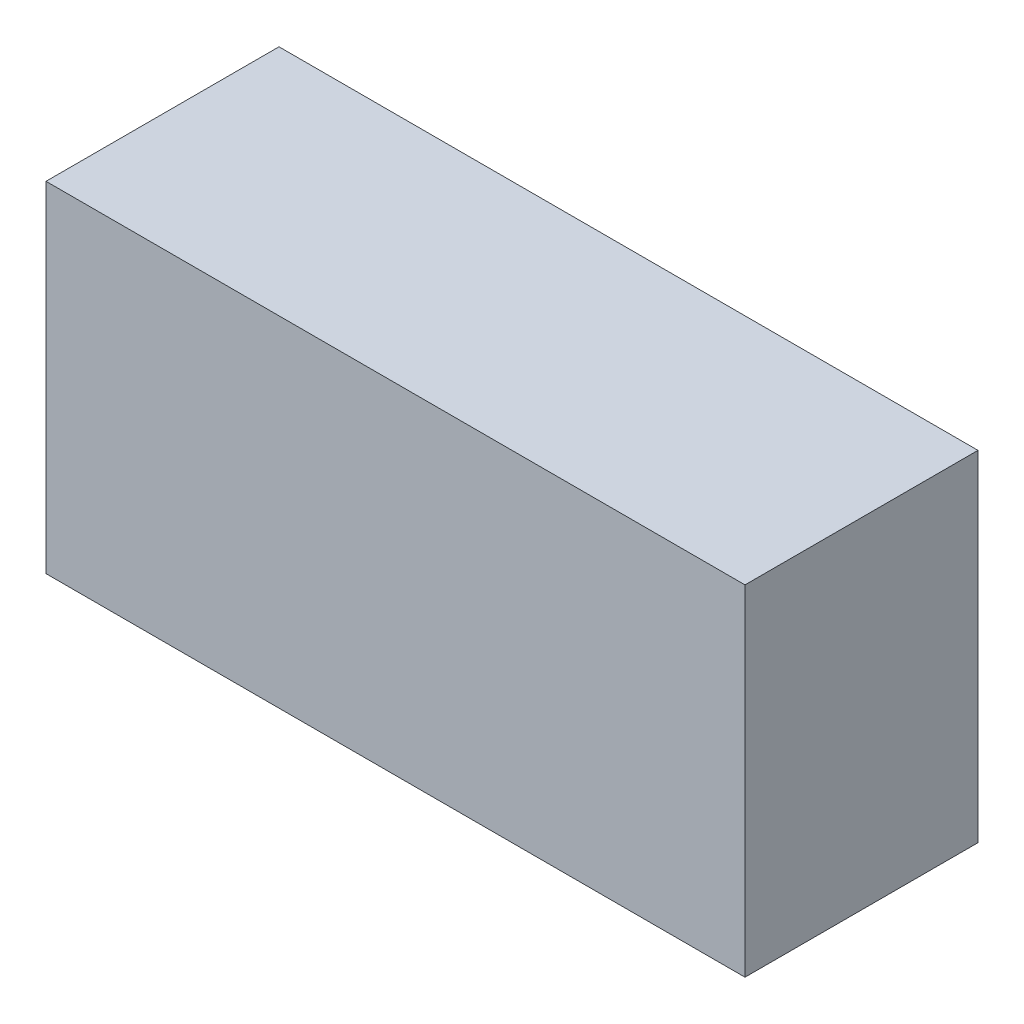
ISO-10303-21;
HEADER;
FILE_DESCRIPTION(('STEP AP214'),'2;1');
FILE_NAME('part.step','',(''),(''),'','','');
FILE_SCHEMA(('AUTOMOTIVE_DESIGN { 1 0 10303 214 1 1 1 1 }'));
ENDSEC;
DATA;
#1=APPLICATION_CONTEXT('core data for automotive mechanical design processes');
#2=APPLICATION_PROTOCOL_DEFINITION('international standard','automotive_design',2000,#1);
#3=PRODUCT_CONTEXT('',#1,'mechanical');
#4=PRODUCT('Part','Part','',(#3));
#5=PRODUCT_RELATED_PRODUCT_CATEGORY('part','',(#4));
#6=PRODUCT_DEFINITION_FORMATION('','',#4);
#7=PRODUCT_DEFINITION_CONTEXT('part definition',#1,'design');
#8=PRODUCT_DEFINITION('design','',#6,#7);
#9=PRODUCT_DEFINITION_SHAPE('','',#8);
#10=(LENGTH_UNIT() NAMED_UNIT(*) SI_UNIT(.MILLI.,.METRE.));
#11=(NAMED_UNIT(*) PLANE_ANGLE_UNIT() SI_UNIT($,.RADIAN.));
#12=(NAMED_UNIT(*) SI_UNIT($,.STERADIAN.) SOLID_ANGLE_UNIT());
#13=UNCERTAINTY_MEASURE_WITH_UNIT(LENGTH_MEASURE(1.E-05),#10,'distance_accuracy_value','');
#14=(GEOMETRIC_REPRESENTATION_CONTEXT(3) GLOBAL_UNCERTAINTY_ASSIGNED_CONTEXT((#13)) GLOBAL_UNIT_ASSIGNED_CONTEXT((#10,
#11,#12)) REPRESENTATION_CONTEXT('',''));
#15=CARTESIAN_POINT('',(0.,0.,0.));
#16=DIRECTION('',(0.,0.,1.));
#17=DIRECTION('',(1.,0.,0.));
#18=AXIS2_PLACEMENT_3D('',#15,#16,#17);
#19=CARTESIAN_POINT('',(0.,52.5,0.));
#20=DIRECTION('',(1.,0.,0.));
#21=DIRECTION('',(0.,0.,-1.));
#22=AXIS2_PLACEMENT_3D('',#19,#20,#21);
#23=PLANE('',#22);
#24=DIRECTION('',(0.,0.,1.));
#25=VECTOR('',#24,1.);
#26=CARTESIAN_POINT('',(0.,0.,0.));
#27=LINE('',#26,#25);
#28=CARTESIAN_POINT('',(0.,0.,-36.));
#29=VERTEX_POINT('',#28);
#30=CARTESIAN_POINT('',(0.,0.,0.));
#31=VERTEX_POINT('',#30);
#32=EDGE_CURVE('E112',#29,#31,#27,.T.);
#33=ORIENTED_EDGE('',*,*,#32,.T.);
#34=DIRECTION('',(0.,-1.,0.));
#35=VECTOR('',#34,1.);
#36=CARTESIAN_POINT('',(0.,52.5,0.));
#37=LINE('',#36,#35);
#38=CARTESIAN_POINT('',(0.,52.5,0.));
#39=VERTEX_POINT('',#38);
#40=EDGE_CURVE('E11',#39,#31,#37,.T.);
#41=ORIENTED_EDGE('',*,*,#40,.F.);
#42=DIRECTION('',(0.,0.,1.));
#43=VECTOR('',#42,1.);
#44=CARTESIAN_POINT('',(0.,52.5,0.));
#45=LINE('',#44,#43);
#46=CARTESIAN_POINT('',(0.,52.5,-36.));
#47=VERTEX_POINT('',#46);
#48=EDGE_CURVE('E95',#47,#39,#45,.T.);
#49=ORIENTED_EDGE('',*,*,#48,.F.);
#50=DIRECTION('',(0.,-1.,0.));
#51=VECTOR('',#50,1.);
#52=CARTESIAN_POINT('',(0.,52.5,-36.));
#53=LINE('',#52,#51);
#54=EDGE_CURVE('E108',#47,#29,#53,.T.);
#55=ORIENTED_EDGE('',*,*,#54,.T.);
#56=EDGE_LOOP('',(#33,#41,#49,#55));
#57=FACE_BOUND('',#56,.T.);
#58=ADVANCED_FACE('F43',(#57),#23,.F.);
#59=CARTESIAN_POINT('',(0.,52.5,0.));
#60=DIRECTION('',(0.,0.,-1.));
#61=DIRECTION('',(-1.,0.,0.));
#62=AXIS2_PLACEMENT_3D('',#59,#60,#61);
#63=PLANE('',#62);
#64=DIRECTION('',(1.,0.,0.));
#65=VECTOR('',#64,1.);
#66=CARTESIAN_POINT('',(0.,0.,0.));
#67=LINE('',#66,#65);
#68=CARTESIAN_POINT('',(108.,0.,0.));
#69=VERTEX_POINT('',#68);
#70=EDGE_CURVE('E100',#31,#69,#67,.T.);
#71=ORIENTED_EDGE('',*,*,#70,.T.);
#72=DIRECTION('',(0.,-1.,0.));
#73=VECTOR('',#72,1.);
#74=CARTESIAN_POINT('',(108.,52.5,0.));
#75=LINE('',#74,#73);
#76=CARTESIAN_POINT('',(108.,52.5,0.));
#77=VERTEX_POINT('',#76);
#78=EDGE_CURVE('E52',#77,#69,#75,.T.);
#79=ORIENTED_EDGE('',*,*,#78,.F.);
#80=DIRECTION('',(1.,0.,0.));
#81=VECTOR('',#80,1.);
#82=CARTESIAN_POINT('',(0.,52.5,0.));
#83=LINE('',#82,#81);
#84=EDGE_CURVE('E90',#39,#77,#83,.T.);
#85=ORIENTED_EDGE('',*,*,#84,.F.);
#86=ORIENTED_EDGE('',*,*,#40,.T.);
#87=EDGE_LOOP('',(#71,#79,#85,#86));
#88=FACE_BOUND('',#87,.T.);
#89=ADVANCED_FACE('F99',(#88),#63,.F.);
#90=CARTESIAN_POINT('',(108.,52.5,0.));
#91=DIRECTION('',(-1.,0.,0.));
#92=DIRECTION('',(0.,0.,1.));
#93=AXIS2_PLACEMENT_3D('',#90,#91,#92);
#94=PLANE('',#93);
#95=DIRECTION('',(0.,0.,-1.));
#96=VECTOR('',#95,1.);
#97=CARTESIAN_POINT('',(108.,0.,0.));
#98=LINE('',#97,#96);
#99=CARTESIAN_POINT('',(108.,0.,-36.));
#100=VERTEX_POINT('',#99);
#101=EDGE_CURVE('E77',#69,#100,#98,.T.);
#102=ORIENTED_EDGE('',*,*,#101,.T.);
#103=DIRECTION('',(0.,-1.,0.));
#104=VECTOR('',#103,1.);
#105=CARTESIAN_POINT('',(108.,52.5,-36.));
#106=LINE('',#105,#104);
#107=CARTESIAN_POINT('',(108.,52.5,-36.));
#108=VERTEX_POINT('',#107);
#109=EDGE_CURVE('E102',#108,#100,#106,.T.);
#110=ORIENTED_EDGE('',*,*,#109,.F.);
#111=DIRECTION('',(0.,0.,-1.));
#112=VECTOR('',#111,1.);
#113=CARTESIAN_POINT('',(108.,52.5,0.));
#114=LINE('',#113,#112);
#115=EDGE_CURVE('E93',#77,#108,#114,.T.);
#116=ORIENTED_EDGE('',*,*,#115,.F.);
#117=ORIENTED_EDGE('',*,*,#78,.T.);
#118=EDGE_LOOP('',(#102,#110,#116,#117));
#119=FACE_BOUND('',#118,.T.);
#120=ADVANCED_FACE('F103',(#119),#94,.F.);
#121=CARTESIAN_POINT('',(0.,52.5,-36.));
#122=DIRECTION('',(0.,0.,1.));
#123=DIRECTION('',(1.,0.,0.));
#124=AXIS2_PLACEMENT_3D('',#121,#122,#123);
#125=PLANE('',#124);
#126=DIRECTION('',(-1.,0.,0.));
#127=VECTOR('',#126,1.);
#128=CARTESIAN_POINT('',(0.,0.,-36.));
#129=LINE('',#128,#127);
#130=EDGE_CURVE('E83',#100,#29,#129,.T.);
#131=ORIENTED_EDGE('',*,*,#130,.T.);
#132=ORIENTED_EDGE('',*,*,#54,.F.);
#133=DIRECTION('',(-1.,0.,0.));
#134=VECTOR('',#133,1.);
#135=CARTESIAN_POINT('',(0.,52.5,-36.));
#136=LINE('',#135,#134);
#137=EDGE_CURVE('E60',#108,#47,#136,.T.);
#138=ORIENTED_EDGE('',*,*,#137,.F.);
#139=ORIENTED_EDGE('',*,*,#109,.T.);
#140=EDGE_LOOP('',(#131,#132,#138,#139));
#141=FACE_BOUND('',#140,.T.);
#142=ADVANCED_FACE('F124',(#141),#125,.F.);
#143=CARTESIAN_POINT('',(0.,52.5,0.));
#144=DIRECTION('',(0.,-1.,0.));
#145=DIRECTION('',(0.,0.,-1.));
#146=AXIS2_PLACEMENT_3D('',#143,#144,#145);
#147=PLANE('',#146);
#148=ORIENTED_EDGE('',*,*,#48,.T.);
#149=ORIENTED_EDGE('',*,*,#84,.T.);
#150=ORIENTED_EDGE('',*,*,#115,.T.);
#151=ORIENTED_EDGE('',*,*,#137,.T.);
#152=EDGE_LOOP('',(#148,#149,#150,#151));
#153=FACE_BOUND('',#152,.T.);
#154=ADVANCED_FACE('F91',(#153),#147,.F.);
#155=CARTESIAN_POINT('',(0.,0.,0.));
#156=DIRECTION('',(0.,-1.,0.));
#157=DIRECTION('',(0.,0.,-1.));
#158=AXIS2_PLACEMENT_3D('',#155,#156,#157);
#159=PLANE('',#158);
#160=ORIENTED_EDGE('',*,*,#32,.F.);
#161=ORIENTED_EDGE('',*,*,#130,.F.);
#162=ORIENTED_EDGE('',*,*,#101,.F.);
#163=ORIENTED_EDGE('',*,*,#70,.F.);
#164=EDGE_LOOP('',(#160,#161,#162,#163));
#165=FACE_BOUND('',#164,.T.);
#166=ADVANCED_FACE('F127',(#165),#159,.T.);
#167=CLOSED_SHELL('',(#58,#89,#120,#142,#154,#166));
#168=MANIFOLD_SOLID_BREP('B2',#167);
#169=ADVANCED_BREP_SHAPE_REPRESENTATION('',(#18,#168),#14);
#170=SHAPE_DEFINITION_REPRESENTATION(#9,#169);
ENDSEC;
END-ISO-10303-21;
